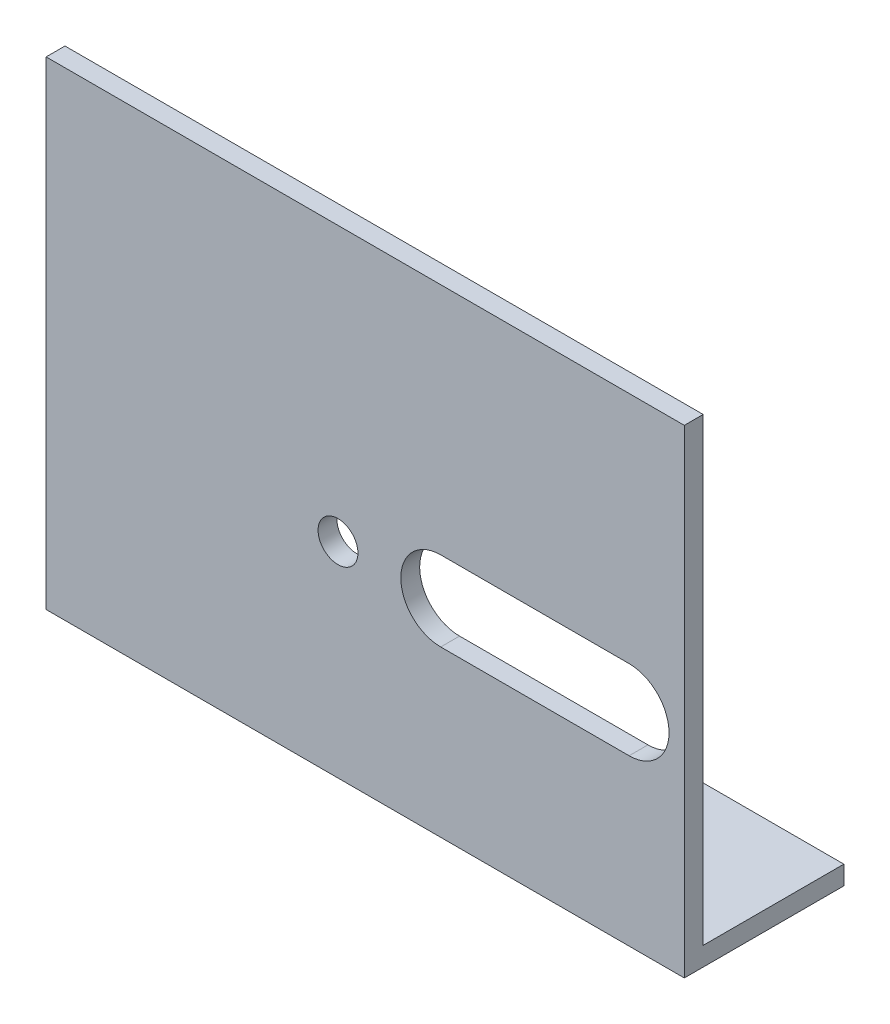
ISO-10303-21;
HEADER;
FILE_DESCRIPTION(('STEP AP214'),'2;1');
FILE_NAME('part.step','',(''),(''),'','','');
FILE_SCHEMA(('AUTOMOTIVE_DESIGN { 1 0 10303 214 1 1 1 1 }'));
ENDSEC;
DATA;
#1=APPLICATION_CONTEXT('core data for automotive mechanical design processes');
#2=APPLICATION_PROTOCOL_DEFINITION('international standard','automotive_design',2000,#1);
#3=PRODUCT_CONTEXT('',#1,'mechanical');
#4=PRODUCT('Part','Part','',(#3));
#5=PRODUCT_RELATED_PRODUCT_CATEGORY('part','',(#4));
#6=PRODUCT_DEFINITION_FORMATION('','',#4);
#7=PRODUCT_DEFINITION_CONTEXT('part definition',#1,'design');
#8=PRODUCT_DEFINITION('design','',#6,#7);
#9=PRODUCT_DEFINITION_SHAPE('','',#8);
#10=(LENGTH_UNIT() NAMED_UNIT(*) SI_UNIT(.MILLI.,.METRE.));
#11=(NAMED_UNIT(*) PLANE_ANGLE_UNIT() SI_UNIT($,.RADIAN.));
#12=(NAMED_UNIT(*) SI_UNIT($,.STERADIAN.) SOLID_ANGLE_UNIT());
#13=UNCERTAINTY_MEASURE_WITH_UNIT(LENGTH_MEASURE(1.E-05),#10,'distance_accuracy_value','');
#14=(GEOMETRIC_REPRESENTATION_CONTEXT(3) GLOBAL_UNCERTAINTY_ASSIGNED_CONTEXT((#13)) GLOBAL_UNIT_ASSIGNED_CONTEXT((#10,
#11,#12)) REPRESENTATION_CONTEXT('',''));
#15=CARTESIAN_POINT('',(0.,0.,0.));
#16=DIRECTION('',(0.,0.,1.));
#17=DIRECTION('',(1.,0.,0.));
#18=AXIS2_PLACEMENT_3D('',#15,#16,#17);
#19=CARTESIAN_POINT('',(50.8,76.2,-3.));
#20=DIRECTION('',(0.,-1.,0.));
#21=DIRECTION('',(0.,0.,-1.));
#22=AXIS2_PLACEMENT_3D('',#19,#20,#21);
#23=PLANE('',#22);
#24=DIRECTION('',(0.,0.,1.));
#25=VECTOR('',#24,1.);
#26=CARTESIAN_POINT('',(-50.8,76.2,-3.));
#27=LINE('',#26,#25);
#28=CARTESIAN_POINT('',(-50.8,76.2,-3.));
#29=VERTEX_POINT('',#28);
#30=CARTESIAN_POINT('',(-50.8,76.2,0.));
#31=VERTEX_POINT('',#30);
#32=EDGE_CURVE('E136',#29,#31,#27,.T.);
#33=ORIENTED_EDGE('',*,*,#32,.T.);
#34=DIRECTION('',(-1.,0.,0.));
#35=VECTOR('',#34,1.);
#36=CARTESIAN_POINT('',(50.8,76.2,0.));
#37=LINE('',#36,#35);
#38=CARTESIAN_POINT('',(50.8,76.2,0.));
#39=VERTEX_POINT('',#38);
#40=EDGE_CURVE('E179',#39,#31,#37,.T.);
#41=ORIENTED_EDGE('',*,*,#40,.F.);
#42=DIRECTION('',(0.,0.,1.));
#43=VECTOR('',#42,1.);
#44=CARTESIAN_POINT('',(50.8,76.2,-3.));
#45=LINE('',#44,#43);
#46=CARTESIAN_POINT('',(50.8,76.2,-3.));
#47=VERTEX_POINT('',#46);
#48=EDGE_CURVE('E139',#47,#39,#45,.T.);
#49=ORIENTED_EDGE('',*,*,#48,.F.);
#50=DIRECTION('',(-1.,0.,0.));
#51=VECTOR('',#50,1.);
#52=CARTESIAN_POINT('',(50.8,76.2,-3.));
#53=LINE('',#52,#51);
#54=EDGE_CURVE('E153',#47,#29,#53,.T.);
#55=ORIENTED_EDGE('',*,*,#54,.T.);
#56=EDGE_LOOP('',(#33,#41,#49,#55));
#57=FACE_BOUND('',#56,.T.);
#58=ADVANCED_FACE('F33',(#57),#23,.F.);
#59=CARTESIAN_POINT('',(50.8,76.2,0.));
#60=DIRECTION('',(0.,0.,-1.));
#61=DIRECTION('',(0.,1.,0.));
#62=AXIS2_PLACEMENT_3D('',#59,#60,#61);
#63=PLANE('',#62);
#64=CARTESIAN_POINT('',(-4.33424931274261,32.6,0.));
#65=DIRECTION('',(0.,0.,1.));
#66=DIRECTION('',(1.,0.,0.));
#67=AXIS2_PLACEMENT_3D('',#64,#65,#66);
#68=CIRCLE('',#67,3.175);
#69=CARTESIAN_POINT('',(-1.15924931274262,32.6,0.));
#70=VERTEX_POINT('',#69);
#71=EDGE_CURVE('E304',#70,#70,#68,.T.);
#72=ORIENTED_EDGE('',*,*,#71,.F.);
#73=EDGE_LOOP('',(#72));
#74=FACE_BOUND('',#73,.T.);
#75=DIRECTION('',(-1.,0.,0.));
#76=VECTOR('',#75,1.);
#77=CARTESIAN_POINT('',(42.0157506872574,38.95,0.));
#78=LINE('',#77,#76);
#79=CARTESIAN_POINT('',(42.0157506872574,38.95,0.));
#80=VERTEX_POINT('',#79);
#81=CARTESIAN_POINT('',(12.0157506872574,38.95,0.));
#82=VERTEX_POINT('',#81);
#83=EDGE_CURVE('E122',#80,#82,#78,.T.);
#84=ORIENTED_EDGE('',*,*,#83,.F.);
#85=CARTESIAN_POINT('',(42.0157506872574,32.6,0.));
#86=DIRECTION('',(0.,0.,1.));
#87=DIRECTION('',(1.,0.,0.));
#88=AXIS2_PLACEMENT_3D('',#85,#86,#87);
#89=CIRCLE('',#88,6.35);
#90=CARTESIAN_POINT('',(42.0157506872574,26.25,0.));
#91=VERTEX_POINT('',#90);
#92=EDGE_CURVE('E48',#91,#80,#89,.T.);
#93=ORIENTED_EDGE('',*,*,#92,.F.);
#94=DIRECTION('',(1.,0.,0.));
#95=VECTOR('',#94,1.);
#96=CARTESIAN_POINT('',(42.0157506872574,26.25,0.));
#97=LINE('',#96,#95);
#98=CARTESIAN_POINT('',(12.0157506872574,26.25,0.));
#99=VERTEX_POINT('',#98);
#100=EDGE_CURVE('E129',#99,#91,#97,.T.);
#101=ORIENTED_EDGE('',*,*,#100,.F.);
#102=CARTESIAN_POINT('',(12.0157506872574,32.6,0.));
#103=DIRECTION('',(0.,0.,1.));
#104=DIRECTION('',(1.,0.,0.));
#105=AXIS2_PLACEMENT_3D('',#102,#103,#104);
#106=CIRCLE('',#105,6.35);
#107=EDGE_CURVE('E113',#82,#99,#106,.T.);
#108=ORIENTED_EDGE('',*,*,#107,.F.);
#109=EDGE_LOOP('',(#84,#93,#101,#108));
#110=FACE_BOUND('',#109,.T.);
#111=DIRECTION('',(0.,-1.,0.));
#112=VECTOR('',#111,1.);
#113=CARTESIAN_POINT('',(-50.8,76.2,0.));
#114=LINE('',#113,#112);
#115=CARTESIAN_POINT('',(-50.8,0.,0.));
#116=VERTEX_POINT('',#115);
#117=EDGE_CURVE('E156',#31,#116,#114,.T.);
#118=ORIENTED_EDGE('',*,*,#117,.T.);
#119=DIRECTION('',(-1.,0.,0.));
#120=VECTOR('',#119,1.);
#121=CARTESIAN_POINT('',(50.8,0.,0.));
#122=LINE('',#121,#120);
#123=CARTESIAN_POINT('',(50.8,0.,0.));
#124=VERTEX_POINT('',#123);
#125=EDGE_CURVE('E176',#124,#116,#122,.T.);
#126=ORIENTED_EDGE('',*,*,#125,.F.);
#127=DIRECTION('',(0.,-1.,0.));
#128=VECTOR('',#127,1.);
#129=CARTESIAN_POINT('',(50.8,76.2,0.));
#130=LINE('',#129,#128);
#131=EDGE_CURVE('E142',#39,#124,#130,.T.);
#132=ORIENTED_EDGE('',*,*,#131,.F.);
#133=ORIENTED_EDGE('',*,*,#40,.T.);
#134=EDGE_LOOP('',(#118,#126,#132,#133));
#135=FACE_BOUND('',#134,.T.);
#136=ADVANCED_FACE('F126',(#74,#110,#135),#63,.F.);
#137=CARTESIAN_POINT('',(50.8,0.,0.));
#138=DIRECTION('',(0.,1.,0.));
#139=DIRECTION('',(0.,0.,1.));
#140=AXIS2_PLACEMENT_3D('',#137,#138,#139);
#141=PLANE('',#140);
#142=DIRECTION('',(0.,0.,-1.));
#143=VECTOR('',#142,1.);
#144=CARTESIAN_POINT('',(-50.8,0.,0.));
#145=LINE('',#144,#143);
#146=CARTESIAN_POINT('',(-50.8,0.,-25.4));
#147=VERTEX_POINT('',#146);
#148=EDGE_CURVE('E158',#116,#147,#145,.T.);
#149=ORIENTED_EDGE('',*,*,#148,.T.);
#150=DIRECTION('',(-1.,0.,0.));
#151=VECTOR('',#150,1.);
#152=CARTESIAN_POINT('',(50.8,0.,-25.4));
#153=LINE('',#152,#151);
#154=CARTESIAN_POINT('',(50.8,0.,-25.4));
#155=VERTEX_POINT('',#154);
#156=EDGE_CURVE('E173',#155,#147,#153,.T.);
#157=ORIENTED_EDGE('',*,*,#156,.F.);
#158=DIRECTION('',(0.,0.,-1.));
#159=VECTOR('',#158,1.);
#160=CARTESIAN_POINT('',(50.8,0.,0.));
#161=LINE('',#160,#159);
#162=EDGE_CURVE('E145',#124,#155,#161,.T.);
#163=ORIENTED_EDGE('',*,*,#162,.F.);
#164=ORIENTED_EDGE('',*,*,#125,.T.);
#165=EDGE_LOOP('',(#149,#157,#163,#164));
#166=FACE_BOUND('',#165,.T.);
#167=ADVANCED_FACE('F212',(#166),#141,.F.);
#168=CARTESIAN_POINT('',(50.8,0.,-25.4));
#169=DIRECTION('',(0.,0.,1.));
#170=DIRECTION('',(1.,0.,0.));
#171=AXIS2_PLACEMENT_3D('',#168,#169,#170);
#172=PLANE('',#171);
#173=DIRECTION('',(0.,1.,0.));
#174=VECTOR('',#173,1.);
#175=CARTESIAN_POINT('',(-50.8,0.,-25.4));
#176=LINE('',#175,#174);
#177=CARTESIAN_POINT('',(-50.8,3.,-25.4));
#178=VERTEX_POINT('',#177);
#179=EDGE_CURVE('E160',#147,#178,#176,.T.);
#180=ORIENTED_EDGE('',*,*,#179,.T.);
#181=DIRECTION('',(-1.,0.,0.));
#182=VECTOR('',#181,1.);
#183=CARTESIAN_POINT('',(50.8,3.,-25.4));
#184=LINE('',#183,#182);
#185=CARTESIAN_POINT('',(50.8,3.,-25.4));
#186=VERTEX_POINT('',#185);
#187=EDGE_CURVE('E170',#186,#178,#184,.T.);
#188=ORIENTED_EDGE('',*,*,#187,.F.);
#189=DIRECTION('',(0.,1.,0.));
#190=VECTOR('',#189,1.);
#191=CARTESIAN_POINT('',(50.8,0.,-25.4));
#192=LINE('',#191,#190);
#193=EDGE_CURVE('E147',#155,#186,#192,.T.);
#194=ORIENTED_EDGE('',*,*,#193,.F.);
#195=ORIENTED_EDGE('',*,*,#156,.T.);
#196=EDGE_LOOP('',(#180,#188,#194,#195));
#197=FACE_BOUND('',#196,.T.);
#198=ADVANCED_FACE('F232',(#197),#172,.F.);
#199=CARTESIAN_POINT('',(50.8,3.,-25.4));
#200=DIRECTION('',(0.,-1.,0.));
#201=DIRECTION('',(0.,0.,-1.));
#202=AXIS2_PLACEMENT_3D('',#199,#200,#201);
#203=PLANE('',#202);
#204=DIRECTION('',(0.,0.,1.));
#205=VECTOR('',#204,1.);
#206=CARTESIAN_POINT('',(-50.8,3.,-25.4));
#207=LINE('',#206,#205);
#208=CARTESIAN_POINT('',(-50.8,3.,-3.));
#209=VERTEX_POINT('',#208);
#210=EDGE_CURVE('E162',#178,#209,#207,.T.);
#211=ORIENTED_EDGE('',*,*,#210,.T.);
#212=DIRECTION('',(-1.,0.,0.));
#213=VECTOR('',#212,1.);
#214=CARTESIAN_POINT('',(50.8,3.,-3.));
#215=LINE('',#214,#213);
#216=CARTESIAN_POINT('',(50.8,3.,-3.));
#217=VERTEX_POINT('',#216);
#218=EDGE_CURVE('E167',#217,#209,#215,.T.);
#219=ORIENTED_EDGE('',*,*,#218,.F.);
#220=DIRECTION('',(0.,0.,1.));
#221=VECTOR('',#220,1.);
#222=CARTESIAN_POINT('',(50.8,3.,-25.4));
#223=LINE('',#222,#221);
#224=EDGE_CURVE('E149',#186,#217,#223,.T.);
#225=ORIENTED_EDGE('',*,*,#224,.F.);
#226=ORIENTED_EDGE('',*,*,#187,.T.);
#227=EDGE_LOOP('',(#211,#219,#225,#226));
#228=FACE_BOUND('',#227,.T.);
#229=ADVANCED_FACE('F229',(#228),#203,.F.);
#230=CARTESIAN_POINT('',(50.8,3.,-3.));
#231=DIRECTION('',(0.,0.,1.));
#232=DIRECTION('',(1.,0.,0.));
#233=AXIS2_PLACEMENT_3D('',#230,#231,#232);
#234=PLANE('',#233);
#235=CARTESIAN_POINT('',(-4.33424931274261,32.6,-3.));
#236=DIRECTION('',(0.,0.,1.));
#237=DIRECTION('',(1.,0.,0.));
#238=AXIS2_PLACEMENT_3D('',#235,#236,#237);
#239=CIRCLE('',#238,3.175);
#240=CARTESIAN_POINT('',(-1.15924931274262,32.6,-3.));
#241=VERTEX_POINT('',#240);
#242=EDGE_CURVE('E36',#241,#241,#239,.T.);
#243=ORIENTED_EDGE('',*,*,#242,.T.);
#244=EDGE_LOOP('',(#243));
#245=FACE_BOUND('',#244,.T.);
#246=DIRECTION('',(1.,0.,0.));
#247=VECTOR('',#246,1.);
#248=CARTESIAN_POINT('',(50.8,26.25,-3.));
#249=LINE('',#248,#247);
#250=CARTESIAN_POINT('',(12.0157506872574,26.25,-3.));
#251=VERTEX_POINT('',#250);
#252=CARTESIAN_POINT('',(42.0157506872574,26.25,-3.));
#253=VERTEX_POINT('',#252);
#254=EDGE_CURVE('E41',#251,#253,#249,.T.);
#255=ORIENTED_EDGE('',*,*,#254,.T.);
#256=CARTESIAN_POINT('',(42.0157506872574,32.6,-3.));
#257=DIRECTION('',(0.,0.,1.));
#258=DIRECTION('',(1.,0.,0.));
#259=AXIS2_PLACEMENT_3D('',#256,#257,#258);
#260=CIRCLE('',#259,6.35);
#261=CARTESIAN_POINT('',(42.0157506872574,38.95,-3.));
#262=VERTEX_POINT('',#261);
#263=EDGE_CURVE('E11',#253,#262,#260,.T.);
#264=ORIENTED_EDGE('',*,*,#263,.T.);
#265=DIRECTION('',(-1.,0.,0.));
#266=VECTOR('',#265,1.);
#267=CARTESIAN_POINT('',(50.8,38.95,-3.));
#268=LINE('',#267,#266);
#269=CARTESIAN_POINT('',(12.0157506872574,38.95,-3.));
#270=VERTEX_POINT('',#269);
#271=EDGE_CURVE('E182',#262,#270,#268,.T.);
#272=ORIENTED_EDGE('',*,*,#271,.T.);
#273=CARTESIAN_POINT('',(12.0157506872574,32.6,-3.));
#274=DIRECTION('',(0.,0.,1.));
#275=DIRECTION('',(1.,0.,0.));
#276=AXIS2_PLACEMENT_3D('',#273,#274,#275);
#277=CIRCLE('',#276,6.35);
#278=EDGE_CURVE('E116',#270,#251,#277,.T.);
#279=ORIENTED_EDGE('',*,*,#278,.T.);
#280=EDGE_LOOP('',(#255,#264,#272,#279));
#281=FACE_BOUND('',#280,.T.);
#282=DIRECTION('',(0.,1.,0.));
#283=VECTOR('',#282,1.);
#284=CARTESIAN_POINT('',(-50.8,3.,-3.));
#285=LINE('',#284,#283);
#286=EDGE_CURVE('E143',#209,#29,#285,.T.);
#287=ORIENTED_EDGE('',*,*,#286,.T.);
#288=ORIENTED_EDGE('',*,*,#54,.F.);
#289=DIRECTION('',(0.,1.,0.));
#290=VECTOR('',#289,1.);
#291=CARTESIAN_POINT('',(50.8,3.,-3.));
#292=LINE('',#291,#290);
#293=EDGE_CURVE('E151',#217,#47,#292,.T.);
#294=ORIENTED_EDGE('',*,*,#293,.F.);
#295=ORIENTED_EDGE('',*,*,#218,.T.);
#296=EDGE_LOOP('',(#287,#288,#294,#295));
#297=FACE_BOUND('',#296,.T.);
#298=ADVANCED_FACE('F187',(#245,#281,#297),#234,.F.);
#299=CARTESIAN_POINT('',(50.8,0.,0.));
#300=DIRECTION('',(1.,0.,0.));
#301=DIRECTION('',(0.,0.,-1.));
#302=AXIS2_PLACEMENT_3D('',#299,#300,#301);
#303=PLANE('',#302);
#304=ORIENTED_EDGE('',*,*,#48,.T.);
#305=ORIENTED_EDGE('',*,*,#131,.T.);
#306=ORIENTED_EDGE('',*,*,#162,.T.);
#307=ORIENTED_EDGE('',*,*,#193,.T.);
#308=ORIENTED_EDGE('',*,*,#224,.T.);
#309=ORIENTED_EDGE('',*,*,#293,.T.);
#310=EDGE_LOOP('',(#304,#305,#306,#307,#308,#309));
#311=FACE_BOUND('',#310,.T.);
#312=ADVANCED_FACE('F201',(#311),#303,.T.);
#313=CARTESIAN_POINT('',(-50.8,0.,0.));
#314=DIRECTION('',(1.,0.,0.));
#315=DIRECTION('',(0.,0.,-1.));
#316=AXIS2_PLACEMENT_3D('',#313,#314,#315);
#317=PLANE('',#316);
#318=ORIENTED_EDGE('',*,*,#32,.F.);
#319=ORIENTED_EDGE('',*,*,#286,.F.);
#320=ORIENTED_EDGE('',*,*,#210,.F.);
#321=ORIENTED_EDGE('',*,*,#179,.F.);
#322=ORIENTED_EDGE('',*,*,#148,.F.);
#323=ORIENTED_EDGE('',*,*,#117,.F.);
#324=EDGE_LOOP('',(#318,#319,#320,#321,#322,#323));
#325=FACE_BOUND('',#324,.T.);
#326=ADVANCED_FACE('F194',(#325),#317,.F.);
#327=CARTESIAN_POINT('',(42.0157506872574,32.6,-25.4));
#328=DIRECTION('',(0.,0.,1.));
#329=DIRECTION('',(1.,0.,0.));
#330=AXIS2_PLACEMENT_3D('',#327,#328,#329);
#331=CYLINDRICAL_SURFACE('',#330,6.35);
#332=DIRECTION('',(0.,0.,1.));
#333=VECTOR('',#332,1.);
#334=CARTESIAN_POINT('',(42.0157506872574,26.25,-25.4));
#335=LINE('',#334,#333);
#336=EDGE_CURVE('E134',#253,#91,#335,.T.);
#337=ORIENTED_EDGE('',*,*,#336,.T.);
#338=ORIENTED_EDGE('',*,*,#92,.T.);
#339=DIRECTION('',(0.,0.,1.));
#340=VECTOR('',#339,1.);
#341=CARTESIAN_POINT('',(42.0157506872574,38.95,-25.4));
#342=LINE('',#341,#340);
#343=EDGE_CURVE('E119',#262,#80,#342,.T.);
#344=ORIENTED_EDGE('',*,*,#343,.F.);
#345=ORIENTED_EDGE('',*,*,#263,.F.);
#346=EDGE_LOOP('',(#337,#338,#344,#345));
#347=FACE_BOUND('',#346,.T.);
#348=ADVANCED_FACE('F192',(#347),#331,.F.);
#349=CARTESIAN_POINT('',(42.0157506872574,26.25,-25.4));
#350=DIRECTION('',(0.,-1.,0.));
#351=DIRECTION('',(0.,0.,-1.));
#352=AXIS2_PLACEMENT_3D('',#349,#350,#351);
#353=PLANE('',#352);
#354=DIRECTION('',(0.,0.,1.));
#355=VECTOR('',#354,1.);
#356=CARTESIAN_POINT('',(12.0157506872574,26.25,-25.4));
#357=LINE('',#356,#355);
#358=EDGE_CURVE('E118',#251,#99,#357,.T.);
#359=ORIENTED_EDGE('',*,*,#358,.T.);
#360=ORIENTED_EDGE('',*,*,#100,.T.);
#361=ORIENTED_EDGE('',*,*,#336,.F.);
#362=ORIENTED_EDGE('',*,*,#254,.F.);
#363=EDGE_LOOP('',(#359,#360,#361,#362));
#364=FACE_BOUND('',#363,.T.);
#365=ADVANCED_FACE('F191',(#364),#353,.F.);
#366=CARTESIAN_POINT('',(12.0157506872574,32.6,-25.4));
#367=DIRECTION('',(0.,0.,1.));
#368=DIRECTION('',(1.,0.,0.));
#369=AXIS2_PLACEMENT_3D('',#366,#367,#368);
#370=CYLINDRICAL_SURFACE('',#369,6.35);
#371=DIRECTION('',(0.,0.,1.));
#372=VECTOR('',#371,1.);
#373=CARTESIAN_POINT('',(12.0157506872574,38.95,-25.4));
#374=LINE('',#373,#372);
#375=EDGE_CURVE('E56',#270,#82,#374,.T.);
#376=ORIENTED_EDGE('',*,*,#375,.T.);
#377=ORIENTED_EDGE('',*,*,#107,.T.);
#378=ORIENTED_EDGE('',*,*,#358,.F.);
#379=ORIENTED_EDGE('',*,*,#278,.F.);
#380=EDGE_LOOP('',(#376,#377,#378,#379));
#381=FACE_BOUND('',#380,.T.);
#382=ADVANCED_FACE('F110',(#381),#370,.F.);
#383=CARTESIAN_POINT('',(42.0157506872574,38.95,-25.4));
#384=DIRECTION('',(0.,1.,0.));
#385=DIRECTION('',(-1.,0.,0.));
#386=AXIS2_PLACEMENT_3D('',#383,#384,#385);
#387=PLANE('',#386);
#388=ORIENTED_EDGE('',*,*,#343,.T.);
#389=ORIENTED_EDGE('',*,*,#83,.T.);
#390=ORIENTED_EDGE('',*,*,#375,.F.);
#391=ORIENTED_EDGE('',*,*,#271,.F.);
#392=EDGE_LOOP('',(#388,#389,#390,#391));
#393=FACE_BOUND('',#392,.T.);
#394=ADVANCED_FACE('F123',(#393),#387,.F.);
#395=CARTESIAN_POINT('',(-4.33424931274261,32.6,-25.4));
#396=DIRECTION('',(0.,0.,1.));
#397=DIRECTION('',(1.,0.,0.));
#398=AXIS2_PLACEMENT_3D('',#395,#396,#397);
#399=CYLINDRICAL_SURFACE('',#398,3.175);
#400=ORIENTED_EDGE('',*,*,#71,.T.);
#401=EDGE_LOOP('',(#400));
#402=FACE_BOUND('',#401,.T.);
#403=ORIENTED_EDGE('',*,*,#242,.F.);
#404=EDGE_LOOP('',(#403));
#405=FACE_BOUND('',#404,.T.);
#406=ADVANCED_FACE('F289',(#402,#405),#399,.F.);
#407=CLOSED_SHELL('',(#58,#136,#167,#198,#229,#298,#312,#326,#348,#365,#382,#394,#406));
#408=MANIFOLD_SOLID_BREP('B2',#407);
#409=ADVANCED_BREP_SHAPE_REPRESENTATION('',(#18,#408),#14);
#410=SHAPE_DEFINITION_REPRESENTATION(#9,#409);
ENDSEC;
END-ISO-10303-21;
